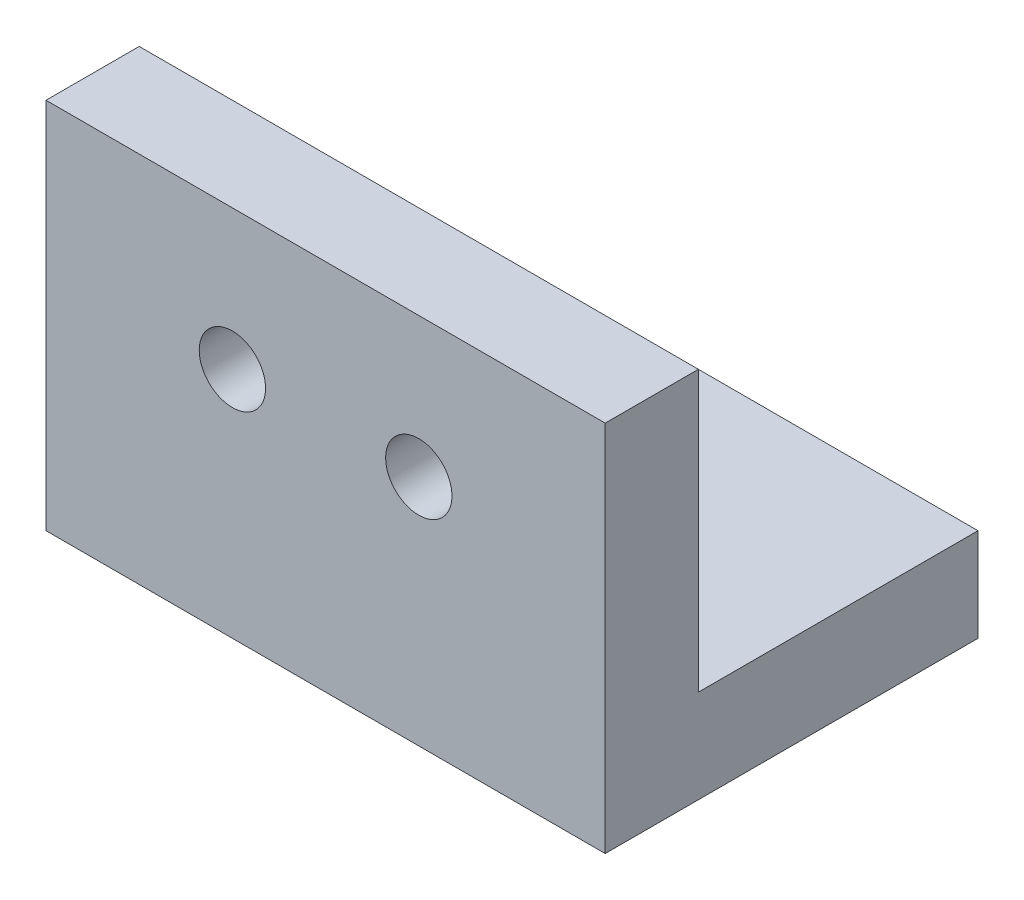
ISO-10303-21;
HEADER;
FILE_DESCRIPTION(('STEP AP214'),'2;1');
FILE_NAME('part.step','',(''),(''),'','','');
FILE_SCHEMA(('AUTOMOTIVE_DESIGN { 1 0 10303 214 1 1 1 1 }'));
ENDSEC;
DATA;
#1=APPLICATION_CONTEXT('core data for automotive mechanical design processes');
#2=APPLICATION_PROTOCOL_DEFINITION('international standard','automotive_design',2000,#1);
#3=PRODUCT_CONTEXT('',#1,'mechanical');
#4=PRODUCT('Part','Part','',(#3));
#5=PRODUCT_RELATED_PRODUCT_CATEGORY('part','',(#4));
#6=PRODUCT_DEFINITION_FORMATION('','',#4);
#7=PRODUCT_DEFINITION_CONTEXT('part definition',#1,'design');
#8=PRODUCT_DEFINITION('design','',#6,#7);
#9=PRODUCT_DEFINITION_SHAPE('','',#8);
#10=(LENGTH_UNIT() NAMED_UNIT(*) SI_UNIT(.MILLI.,.METRE.));
#11=(NAMED_UNIT(*) PLANE_ANGLE_UNIT() SI_UNIT($,.RADIAN.));
#12=(NAMED_UNIT(*) SI_UNIT($,.STERADIAN.) SOLID_ANGLE_UNIT());
#13=UNCERTAINTY_MEASURE_WITH_UNIT(LENGTH_MEASURE(1.E-05),#10,'distance_accuracy_value','');
#14=(GEOMETRIC_REPRESENTATION_CONTEXT(3) GLOBAL_UNCERTAINTY_ASSIGNED_CONTEXT((#13)) GLOBAL_UNIT_ASSIGNED_CONTEXT((#10,
#11,#12)) REPRESENTATION_CONTEXT('',''));
#15=CARTESIAN_POINT('',(0.,0.,0.));
#16=DIRECTION('',(0.,0.,1.));
#17=DIRECTION('',(1.,0.,0.));
#18=AXIS2_PLACEMENT_3D('',#15,#16,#17);
#19=CARTESIAN_POINT('',(19.05,0.,-12.7));
#20=DIRECTION('',(0.,1.,0.));
#21=DIRECTION('',(0.,0.,1.));
#22=AXIS2_PLACEMENT_3D('',#19,#20,#21);
#23=PLANE('',#22);
#24=CARTESIAN_POINT('',(6.35,0.,-7.9375));
#25=DIRECTION('',(0.,1.,0.));
#26=DIRECTION('',(0.,0.,1.));
#27=AXIS2_PLACEMENT_3D('',#24,#25,#26);
#28=CIRCLE('',#27,1.13029999999999);
#29=CARTESIAN_POINT('',(6.35,0.,-6.80720000000001));
#30=VERTEX_POINT('',#29);
#31=EDGE_CURVE('E167',#30,#30,#28,.T.);
#32=ORIENTED_EDGE('',*,*,#31,.T.);
#33=EDGE_LOOP('',(#32));
#34=FACE_BOUND('',#33,.T.);
#35=CARTESIAN_POINT('',(12.7,0.,-7.9375));
#36=DIRECTION('',(0.,1.,0.));
#37=DIRECTION('',(0.,0.,1.));
#38=AXIS2_PLACEMENT_3D('',#35,#36,#37);
#39=CIRCLE('',#38,1.13029999999999);
#40=CARTESIAN_POINT('',(12.7,0.,-6.80720000000001));
#41=VERTEX_POINT('',#40);
#42=EDGE_CURVE('E170',#41,#41,#39,.T.);
#43=ORIENTED_EDGE('',*,*,#42,.T.);
#44=EDGE_LOOP('',(#43));
#45=FACE_BOUND('',#44,.T.);
#46=DIRECTION('',(0.,0.,-1.));
#47=VECTOR('',#46,1.);
#48=CARTESIAN_POINT('',(0.,0.,-12.7));
#49=LINE('',#48,#47);
#50=CARTESIAN_POINT('',(0.,0.,0.));
#51=VERTEX_POINT('',#50);
#52=CARTESIAN_POINT('',(0.,0.,-12.7));
#53=VERTEX_POINT('',#52);
#54=EDGE_CURVE('E120',#51,#53,#49,.T.);
#55=ORIENTED_EDGE('',*,*,#54,.T.);
#56=DIRECTION('',(-1.,0.,0.));
#57=VECTOR('',#56,1.);
#58=CARTESIAN_POINT('',(19.05,0.,-12.7));
#59=LINE('',#58,#57);
#60=CARTESIAN_POINT('',(19.05,0.,-12.7));
#61=VERTEX_POINT('',#60);
#62=EDGE_CURVE('E11',#61,#53,#59,.T.);
#63=ORIENTED_EDGE('',*,*,#62,.F.);
#64=DIRECTION('',(0.,0.,-1.));
#65=VECTOR('',#64,1.);
#66=CARTESIAN_POINT('',(19.05,0.,-12.7));
#67=LINE('',#66,#65);
#68=CARTESIAN_POINT('',(19.05,0.,0.));
#69=VERTEX_POINT('',#68);
#70=EDGE_CURVE('E131',#69,#61,#67,.T.);
#71=ORIENTED_EDGE('',*,*,#70,.F.);
#72=DIRECTION('',(-1.,0.,0.));
#73=VECTOR('',#72,1.);
#74=CARTESIAN_POINT('',(19.05,0.,0.));
#75=LINE('',#74,#73);
#76=EDGE_CURVE('E116',#69,#51,#75,.T.);
#77=ORIENTED_EDGE('',*,*,#76,.T.);
#78=EDGE_LOOP('',(#55,#63,#71,#77));
#79=FACE_BOUND('',#78,.T.);
#80=ADVANCED_FACE('F35',(#34,#45,#79),#23,.F.);
#81=CARTESIAN_POINT('',(19.05,3.175,-12.7));
#82=DIRECTION('',(0.,0.,1.));
#83=DIRECTION('',(0.,-1.,0.));
#84=AXIS2_PLACEMENT_3D('',#81,#82,#83);
#85=PLANE('',#84);
#86=DIRECTION('',(0.,1.,0.));
#87=VECTOR('',#86,1.);
#88=CARTESIAN_POINT('',(0.,3.175,-12.7));
#89=LINE('',#88,#87);
#90=CARTESIAN_POINT('',(0.,3.175,-12.7));
#91=VERTEX_POINT('',#90);
#92=EDGE_CURVE('E123',#53,#91,#89,.T.);
#93=ORIENTED_EDGE('',*,*,#92,.T.);
#94=DIRECTION('',(-1.,0.,0.));
#95=VECTOR('',#94,1.);
#96=CARTESIAN_POINT('',(19.05,3.175,-12.7));
#97=LINE('',#96,#95);
#98=CARTESIAN_POINT('',(19.05,3.175,-12.7));
#99=VERTEX_POINT('',#98);
#100=EDGE_CURVE('E44',#99,#91,#97,.T.);
#101=ORIENTED_EDGE('',*,*,#100,.F.);
#102=DIRECTION('',(0.,1.,0.));
#103=VECTOR('',#102,1.);
#104=CARTESIAN_POINT('',(19.05,3.175,-12.7));
#105=LINE('',#104,#103);
#106=EDGE_CURVE('E89',#61,#99,#105,.T.);
#107=ORIENTED_EDGE('',*,*,#106,.F.);
#108=ORIENTED_EDGE('',*,*,#62,.T.);
#109=EDGE_LOOP('',(#93,#101,#107,#108));
#110=FACE_BOUND('',#109,.T.);
#111=ADVANCED_FACE('F159',(#110),#85,.F.);
#112=CARTESIAN_POINT('',(19.05,3.175,-3.175));
#113=DIRECTION('',(0.,-1.,0.));
#114=DIRECTION('',(0.,0.,-1.));
#115=AXIS2_PLACEMENT_3D('',#112,#113,#114);
#116=PLANE('',#115);
#117=CARTESIAN_POINT('',(6.35,3.175,-7.9375));
#118=DIRECTION('',(0.,1.,0.));
#119=DIRECTION('',(0.,0.,1.));
#120=AXIS2_PLACEMENT_3D('',#117,#118,#119);
#121=CIRCLE('',#120,1.13029999999999);
#122=CARTESIAN_POINT('',(6.35,3.175,-6.80720000000001));
#123=VERTEX_POINT('',#122);
#124=EDGE_CURVE('E213',#123,#123,#121,.T.);
#125=ORIENTED_EDGE('',*,*,#124,.F.);
#126=EDGE_LOOP('',(#125));
#127=FACE_BOUND('',#126,.T.);
#128=CARTESIAN_POINT('',(12.7,3.175,-7.9375));
#129=DIRECTION('',(0.,1.,0.));
#130=DIRECTION('',(0.,0.,1.));
#131=AXIS2_PLACEMENT_3D('',#128,#129,#130);
#132=CIRCLE('',#131,1.13029999999999);
#133=CARTESIAN_POINT('',(12.7,3.175,-6.80720000000001));
#134=VERTEX_POINT('',#133);
#135=EDGE_CURVE('E173',#134,#134,#132,.T.);
#136=ORIENTED_EDGE('',*,*,#135,.F.);
#137=EDGE_LOOP('',(#136));
#138=FACE_BOUND('',#137,.T.);
#139=DIRECTION('',(0.,0.,1.));
#140=VECTOR('',#139,1.);
#141=CARTESIAN_POINT('',(0.,3.175,-3.175));
#142=LINE('',#141,#140);
#143=CARTESIAN_POINT('',(0.,3.175,-3.175));
#144=VERTEX_POINT('',#143);
#145=EDGE_CURVE('E126',#91,#144,#142,.T.);
#146=ORIENTED_EDGE('',*,*,#145,.T.);
#147=DIRECTION('',(-1.,0.,0.));
#148=VECTOR('',#147,1.);
#149=CARTESIAN_POINT('',(19.05,3.175,-3.175));
#150=LINE('',#149,#148);
#151=CARTESIAN_POINT('',(19.05,3.175,-3.175));
#152=VERTEX_POINT('',#151);
#153=EDGE_CURVE('E111',#152,#144,#150,.T.);
#154=ORIENTED_EDGE('',*,*,#153,.F.);
#155=DIRECTION('',(0.,0.,1.));
#156=VECTOR('',#155,1.);
#157=CARTESIAN_POINT('',(19.05,3.175,-3.175));
#158=LINE('',#157,#156);
#159=EDGE_CURVE('E102',#99,#152,#158,.T.);
#160=ORIENTED_EDGE('',*,*,#159,.F.);
#161=ORIENTED_EDGE('',*,*,#100,.T.);
#162=EDGE_LOOP('',(#146,#154,#160,#161));
#163=FACE_BOUND('',#162,.T.);
#164=ADVANCED_FACE('F138',(#127,#138,#163),#116,.F.);
#165=CARTESIAN_POINT('',(19.05,12.7,-3.175));
#166=DIRECTION('',(0.,0.,1.));
#167=DIRECTION('',(0.,-1.,0.));
#168=AXIS2_PLACEMENT_3D('',#165,#166,#167);
#169=PLANE('',#168);
#170=CARTESIAN_POINT('',(6.35,7.9375,-3.175));
#171=DIRECTION('',(0.,0.,-1.));
#172=DIRECTION('',(0.,1.,0.));
#173=AXIS2_PLACEMENT_3D('',#170,#171,#172);
#174=CIRCLE('',#173,1.1303);
#175=CARTESIAN_POINT('',(6.35,9.0678,-3.175));
#176=VERTEX_POINT('',#175);
#177=EDGE_CURVE('E172',#176,#176,#174,.T.);
#178=ORIENTED_EDGE('',*,*,#177,.F.);
#179=EDGE_LOOP('',(#178));
#180=FACE_BOUND('',#179,.T.);
#181=CARTESIAN_POINT('',(12.7,7.9375,-3.175));
#182=DIRECTION('',(0.,0.,-1.));
#183=DIRECTION('',(0.,1.,0.));
#184=AXIS2_PLACEMENT_3D('',#181,#182,#183);
#185=CIRCLE('',#184,1.1303);
#186=CARTESIAN_POINT('',(12.7,9.0678,-3.175));
#187=VERTEX_POINT('',#186);
#188=EDGE_CURVE('E181',#187,#187,#185,.T.);
#189=ORIENTED_EDGE('',*,*,#188,.F.);
#190=EDGE_LOOP('',(#189));
#191=FACE_BOUND('',#190,.T.);
#192=DIRECTION('',(0.,1.,0.));
#193=VECTOR('',#192,1.);
#194=CARTESIAN_POINT('',(0.,12.7,-3.175));
#195=LINE('',#194,#193);
#196=CARTESIAN_POINT('',(0.,12.7,-3.175));
#197=VERTEX_POINT('',#196);
#198=EDGE_CURVE('E110',#144,#197,#195,.T.);
#199=ORIENTED_EDGE('',*,*,#198,.T.);
#200=DIRECTION('',(-1.,0.,0.));
#201=VECTOR('',#200,1.);
#202=CARTESIAN_POINT('',(19.05,12.7,-3.175));
#203=LINE('',#202,#201);
#204=CARTESIAN_POINT('',(19.05,12.7,-3.175));
#205=VERTEX_POINT('',#204);
#206=EDGE_CURVE('E107',#205,#197,#203,.T.);
#207=ORIENTED_EDGE('',*,*,#206,.F.);
#208=DIRECTION('',(0.,1.,0.));
#209=VECTOR('',#208,1.);
#210=CARTESIAN_POINT('',(19.05,12.7,-3.175));
#211=LINE('',#210,#209);
#212=EDGE_CURVE('E96',#152,#205,#211,.T.);
#213=ORIENTED_EDGE('',*,*,#212,.F.);
#214=ORIENTED_EDGE('',*,*,#153,.T.);
#215=EDGE_LOOP('',(#199,#207,#213,#214));
#216=FACE_BOUND('',#215,.T.);
#217=ADVANCED_FACE('F108',(#180,#191,#216),#169,.F.);
#218=CARTESIAN_POINT('',(19.05,12.7,0.));
#219=DIRECTION('',(0.,-1.,0.));
#220=DIRECTION('',(0.,0.,-1.));
#221=AXIS2_PLACEMENT_3D('',#218,#219,#220);
#222=PLANE('',#221);
#223=DIRECTION('',(0.,0.,1.));
#224=VECTOR('',#223,1.);
#225=CARTESIAN_POINT('',(0.,12.7,0.));
#226=LINE('',#225,#224);
#227=CARTESIAN_POINT('',(0.,12.7,0.));
#228=VERTEX_POINT('',#227);
#229=EDGE_CURVE('E75',#197,#228,#226,.T.);
#230=ORIENTED_EDGE('',*,*,#229,.T.);
#231=DIRECTION('',(-1.,0.,0.));
#232=VECTOR('',#231,1.);
#233=CARTESIAN_POINT('',(19.05,12.7,0.));
#234=LINE('',#233,#232);
#235=CARTESIAN_POINT('',(19.05,12.7,0.));
#236=VERTEX_POINT('',#235);
#237=EDGE_CURVE('E112',#236,#228,#234,.T.);
#238=ORIENTED_EDGE('',*,*,#237,.F.);
#239=DIRECTION('',(0.,0.,1.));
#240=VECTOR('',#239,1.);
#241=CARTESIAN_POINT('',(19.05,12.7,0.));
#242=LINE('',#241,#240);
#243=EDGE_CURVE('E100',#205,#236,#242,.T.);
#244=ORIENTED_EDGE('',*,*,#243,.F.);
#245=ORIENTED_EDGE('',*,*,#206,.T.);
#246=EDGE_LOOP('',(#230,#238,#244,#245));
#247=FACE_BOUND('',#246,.T.);
#248=ADVANCED_FACE('F114',(#247),#222,.F.);
#249=CARTESIAN_POINT('',(19.05,0.,0.));
#250=DIRECTION('',(0.,0.,-1.));
#251=DIRECTION('',(-1.,0.,0.));
#252=AXIS2_PLACEMENT_3D('',#249,#250,#251);
#253=PLANE('',#252);
#254=CARTESIAN_POINT('',(6.35,7.9375,0.));
#255=DIRECTION('',(0.,0.,-1.));
#256=DIRECTION('',(-1.,0.,0.));
#257=AXIS2_PLACEMENT_3D('',#254,#255,#256);
#258=CIRCLE('',#257,1.1303);
#259=CARTESIAN_POINT('',(5.2197,7.9375,0.));
#260=VERTEX_POINT('',#259);
#261=EDGE_CURVE('E38',#260,#260,#258,.T.);
#262=ORIENTED_EDGE('',*,*,#261,.T.);
#263=EDGE_LOOP('',(#262));
#264=FACE_BOUND('',#263,.T.);
#265=CARTESIAN_POINT('',(12.7,7.9375,0.));
#266=DIRECTION('',(0.,0.,-1.));
#267=DIRECTION('',(-1.,0.,0.));
#268=AXIS2_PLACEMENT_3D('',#265,#266,#267);
#269=CIRCLE('',#268,1.13029999999999);
#270=CARTESIAN_POINT('',(11.5697,7.9375,0.));
#271=VERTEX_POINT('',#270);
#272=EDGE_CURVE('E124',#271,#271,#269,.T.);
#273=ORIENTED_EDGE('',*,*,#272,.T.);
#274=EDGE_LOOP('',(#273));
#275=FACE_BOUND('',#274,.T.);
#276=DIRECTION('',(0.,-1.,0.));
#277=VECTOR('',#276,1.);
#278=CARTESIAN_POINT('',(0.,0.,0.));
#279=LINE('',#278,#277);
#280=EDGE_CURVE('E81',#228,#51,#279,.T.);
#281=ORIENTED_EDGE('',*,*,#280,.T.);
#282=ORIENTED_EDGE('',*,*,#76,.F.);
#283=DIRECTION('',(0.,-1.,0.));
#284=VECTOR('',#283,1.);
#285=CARTESIAN_POINT('',(19.05,0.,0.));
#286=LINE('',#285,#284);
#287=EDGE_CURVE('E52',#236,#69,#286,.T.);
#288=ORIENTED_EDGE('',*,*,#287,.F.);
#289=ORIENTED_EDGE('',*,*,#237,.T.);
#290=EDGE_LOOP('',(#281,#282,#288,#289));
#291=FACE_BOUND('',#290,.T.);
#292=ADVANCED_FACE('F145',(#264,#275,#291),#253,.F.);
#293=CARTESIAN_POINT('',(19.05,0.,0.));
#294=DIRECTION('',(-1.,0.,0.));
#295=DIRECTION('',(0.,0.,1.));
#296=AXIS2_PLACEMENT_3D('',#293,#294,#295);
#297=PLANE('',#296);
#298=ORIENTED_EDGE('',*,*,#70,.T.);
#299=ORIENTED_EDGE('',*,*,#106,.T.);
#300=ORIENTED_EDGE('',*,*,#159,.T.);
#301=ORIENTED_EDGE('',*,*,#212,.T.);
#302=ORIENTED_EDGE('',*,*,#243,.T.);
#303=ORIENTED_EDGE('',*,*,#287,.T.);
#304=EDGE_LOOP('',(#298,#299,#300,#301,#302,#303));
#305=FACE_BOUND('',#304,.T.);
#306=ADVANCED_FACE('F98',(#305),#297,.F.);
#307=CARTESIAN_POINT('',(0.,0.,0.));
#308=DIRECTION('',(-1.,0.,0.));
#309=DIRECTION('',(0.,0.,1.));
#310=AXIS2_PLACEMENT_3D('',#307,#308,#309);
#311=PLANE('',#310);
#312=ORIENTED_EDGE('',*,*,#54,.F.);
#313=ORIENTED_EDGE('',*,*,#280,.F.);
#314=ORIENTED_EDGE('',*,*,#229,.F.);
#315=ORIENTED_EDGE('',*,*,#198,.F.);
#316=ORIENTED_EDGE('',*,*,#145,.F.);
#317=ORIENTED_EDGE('',*,*,#92,.F.);
#318=EDGE_LOOP('',(#312,#313,#314,#315,#316,#317));
#319=FACE_BOUND('',#318,.T.);
#320=ADVANCED_FACE('F141',(#319),#311,.T.);
#321=CARTESIAN_POINT('',(12.7,7.9375,-3.175));
#322=DIRECTION('',(0.,0.,-1.));
#323=DIRECTION('',(0.,1.,0.));
#324=AXIS2_PLACEMENT_3D('',#321,#322,#323);
#325=CYLINDRICAL_SURFACE('',#324,1.13029999999999);
#326=ORIENTED_EDGE('',*,*,#188,.T.);
#327=EDGE_LOOP('',(#326));
#328=FACE_BOUND('',#327,.T.);
#329=ORIENTED_EDGE('',*,*,#272,.F.);
#330=EDGE_LOOP('',(#329));
#331=FACE_BOUND('',#330,.T.);
#332=ADVANCED_FACE('F189',(#328,#331),#325,.F.);
#333=CARTESIAN_POINT('',(6.35,7.9375,-3.175));
#334=DIRECTION('',(0.,0.,-1.));
#335=DIRECTION('',(0.,1.,0.));
#336=AXIS2_PLACEMENT_3D('',#333,#334,#335);
#337=CYLINDRICAL_SURFACE('',#336,1.1303);
#338=ORIENTED_EDGE('',*,*,#177,.T.);
#339=EDGE_LOOP('',(#338));
#340=FACE_BOUND('',#339,.T.);
#341=ORIENTED_EDGE('',*,*,#261,.F.);
#342=EDGE_LOOP('',(#341));
#343=FACE_BOUND('',#342,.T.);
#344=ADVANCED_FACE('F191',(#340,#343),#337,.F.);
#345=CARTESIAN_POINT('',(12.7,3.175,-7.9375));
#346=DIRECTION('',(0.,1.,0.));
#347=DIRECTION('',(0.,0.,1.));
#348=AXIS2_PLACEMENT_3D('',#345,#346,#347);
#349=CYLINDRICAL_SURFACE('',#348,1.13029999999999);
#350=ORIENTED_EDGE('',*,*,#135,.T.);
#351=EDGE_LOOP('',(#350));
#352=FACE_BOUND('',#351,.T.);
#353=ORIENTED_EDGE('',*,*,#42,.F.);
#354=EDGE_LOOP('',(#353));
#355=FACE_BOUND('',#354,.T.);
#356=ADVANCED_FACE('F198',(#352,#355),#349,.F.);
#357=CARTESIAN_POINT('',(6.35,3.175,-7.9375));
#358=DIRECTION('',(0.,1.,0.));
#359=DIRECTION('',(0.,0.,1.));
#360=AXIS2_PLACEMENT_3D('',#357,#358,#359);
#361=CYLINDRICAL_SURFACE('',#360,1.13029999999999);
#362=ORIENTED_EDGE('',*,*,#124,.T.);
#363=EDGE_LOOP('',(#362));
#364=FACE_BOUND('',#363,.T.);
#365=ORIENTED_EDGE('',*,*,#31,.F.);
#366=EDGE_LOOP('',(#365));
#367=FACE_BOUND('',#366,.T.);
#368=ADVANCED_FACE('F204',(#364,#367),#361,.F.);
#369=CLOSED_SHELL('',(#80,#111,#164,#217,#248,#292,#306,#320,#332,#344,#356,#368));
#370=MANIFOLD_SOLID_BREP('B2',#369);
#371=ADVANCED_BREP_SHAPE_REPRESENTATION('',(#18,#370),#14);
#372=SHAPE_DEFINITION_REPRESENTATION(#9,#371);
ENDSEC;
END-ISO-10303-21;
